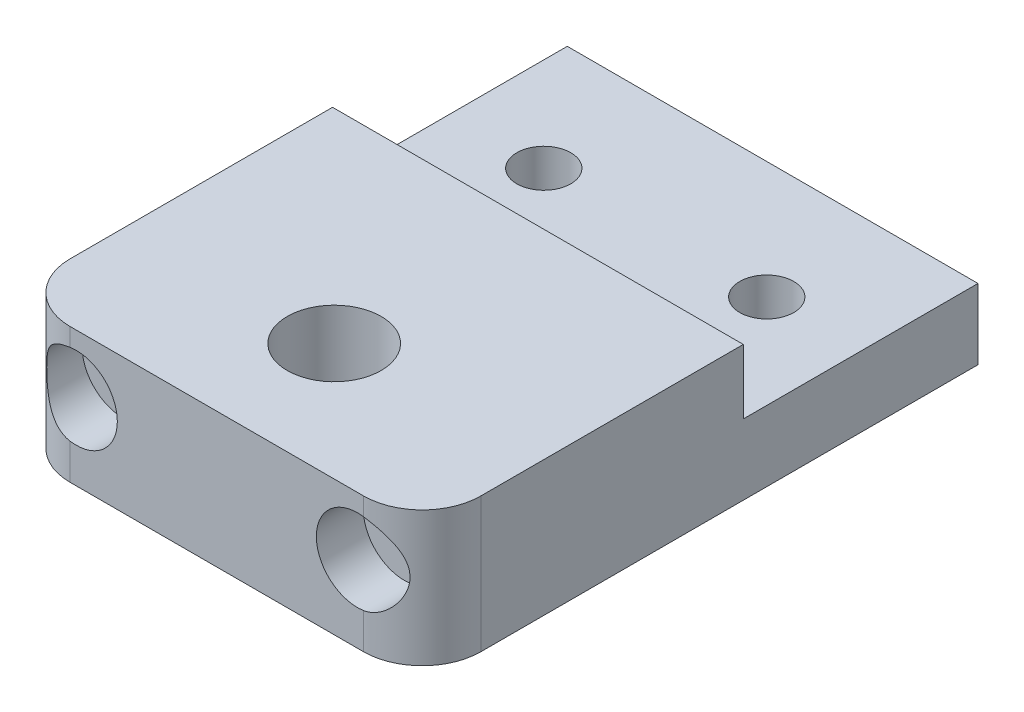
ISO-10303-21;
HEADER;
FILE_DESCRIPTION(('STEP AP214'),'2;1');
FILE_NAME('part.step','',(''),(''),'','','');
FILE_SCHEMA(('AUTOMOTIVE_DESIGN { 1 0 10303 214 1 1 1 1 }'));
ENDSEC;
DATA;
#1=APPLICATION_CONTEXT('core data for automotive mechanical design processes');
#2=APPLICATION_PROTOCOL_DEFINITION('international standard','automotive_design',2000,#1);
#3=PRODUCT_CONTEXT('',#1,'mechanical');
#4=PRODUCT('Part','Part','',(#3));
#5=PRODUCT_RELATED_PRODUCT_CATEGORY('part','',(#4));
#6=PRODUCT_DEFINITION_FORMATION('','',#4);
#7=PRODUCT_DEFINITION_CONTEXT('part definition',#1,'design');
#8=PRODUCT_DEFINITION('design','',#6,#7);
#9=PRODUCT_DEFINITION_SHAPE('','',#8);
#10=(LENGTH_UNIT() NAMED_UNIT(*) SI_UNIT(.MILLI.,.METRE.));
#11=(NAMED_UNIT(*) PLANE_ANGLE_UNIT() SI_UNIT($,.RADIAN.));
#12=(NAMED_UNIT(*) SI_UNIT($,.STERADIAN.) SOLID_ANGLE_UNIT());
#13=UNCERTAINTY_MEASURE_WITH_UNIT(LENGTH_MEASURE(1.E-05),#10,'distance_accuracy_value','');
#14=(GEOMETRIC_REPRESENTATION_CONTEXT(3) GLOBAL_UNCERTAINTY_ASSIGNED_CONTEXT((#13)) GLOBAL_UNIT_ASSIGNED_CONTEXT((#10,
#11,#12)) REPRESENTATION_CONTEXT('',''));
#15=CARTESIAN_POINT('',(0.,0.,0.));
#16=DIRECTION('',(0.,0.,1.));
#17=DIRECTION('',(1.,0.,0.));
#18=AXIS2_PLACEMENT_3D('',#15,#16,#17);
#19=CARTESIAN_POINT('',(0.,5.5,0.));
#20=DIRECTION('',(0.,1.,0.));
#21=DIRECTION('',(0.,0.,1.));
#22=AXIS2_PLACEMENT_3D('',#19,#20,#21);
#23=PLANE('',#22);
#24=DIRECTION('',(1.,0.,0.));
#25=VECTOR('',#24,1.);
#26=CARTESIAN_POINT('',(-17.5,5.5,0.964169605440018));
#27=LINE('',#26,#25);
#28=CARTESIAN_POINT('',(-12.5,5.5,0.964169605440018));
#29=VERTEX_POINT('',#28);
#30=CARTESIAN_POINT('',(12.5,5.5,0.964169605440018));
#31=VERTEX_POINT('',#30);
#32=EDGE_CURVE('E308',#29,#31,#27,.T.);
#33=ORIENTED_EDGE('',*,*,#32,.T.);
#34=CARTESIAN_POINT('',(12.5,5.5,-4.03583039455998));
#35=DIRECTION('',(0.,1.,0.));
#36=DIRECTION('',(0.,0.,1.));
#37=AXIS2_PLACEMENT_3D('',#34,#35,#36);
#38=CIRCLE('',#37,5.);
#39=CARTESIAN_POINT('',(17.5,5.5,-4.03583039455999));
#40=VERTEX_POINT('',#39);
#41=EDGE_CURVE('E189',#31,#40,#38,.T.);
#42=ORIENTED_EDGE('',*,*,#41,.T.);
#43=DIRECTION('',(0.,0.,-1.));
#44=VECTOR('',#43,1.);
#45=CARTESIAN_POINT('',(17.5,5.5,-26.39583039456));
#46=LINE('',#45,#44);
#47=CARTESIAN_POINT('',(17.5,5.5,-26.39583039456));
#48=VERTEX_POINT('',#47);
#49=EDGE_CURVE('E301',#40,#48,#46,.T.);
#50=ORIENTED_EDGE('',*,*,#49,.T.);
#51=DIRECTION('',(-1.,0.,0.));
#52=VECTOR('',#51,1.);
#53=CARTESIAN_POINT('',(-17.5,5.5,-26.39583039456));
#54=LINE('',#53,#52);
#55=CARTESIAN_POINT('',(-17.5,5.5,-26.39583039456));
#56=VERTEX_POINT('',#55);
#57=EDGE_CURVE('E303',#48,#56,#54,.T.);
#58=ORIENTED_EDGE('',*,*,#57,.T.);
#59=DIRECTION('',(0.,0.,1.));
#60=VECTOR('',#59,1.);
#61=CARTESIAN_POINT('',(-17.5,5.5,-26.39583039456));
#62=LINE('',#61,#60);
#63=CARTESIAN_POINT('',(-17.5,5.5,-4.03583039455999));
#64=VERTEX_POINT('',#63);
#65=EDGE_CURVE('E305',#56,#64,#62,.T.);
#66=ORIENTED_EDGE('',*,*,#65,.T.);
#67=CARTESIAN_POINT('',(-12.5,5.5,-4.03583039455998));
#68=DIRECTION('',(0.,1.,0.));
#69=DIRECTION('',(0.,0.,1.));
#70=AXIS2_PLACEMENT_3D('',#67,#68,#69);
#71=CIRCLE('',#70,5.);
#72=EDGE_CURVE('E187',#64,#29,#71,.T.);
#73=ORIENTED_EDGE('',*,*,#72,.T.);
#74=EDGE_LOOP('',(#33,#42,#50,#58,#66,#73));
#75=FACE_BOUND('',#74,.T.);
#76=CARTESIAN_POINT('',(0.,5.5,-9.03583039455998));
#77=DIRECTION('',(0.,1.,0.));
#78=DIRECTION('',(0.,0.,1.));
#79=AXIS2_PLACEMENT_3D('',#76,#77,#78);
#80=CIRCLE('',#79,4.);
#81=CARTESIAN_POINT('',(0.,5.5,-5.03583039455998));
#82=VERTEX_POINT('',#81);
#83=EDGE_CURVE('E295',#82,#82,#80,.T.);
#84=ORIENTED_EDGE('',*,*,#83,.F.);
#85=EDGE_LOOP('',(#84));
#86=FACE_BOUND('',#85,.T.);
#87=ADVANCED_FACE('F82',(#75,#86),#23,.T.);
#88=CARTESIAN_POINT('',(17.5,5.5,-26.39583039456));
#89=DIRECTION('',(-1.,0.,0.));
#90=DIRECTION('',(0.,0.,1.));
#91=AXIS2_PLACEMENT_3D('',#88,#89,#90);
#92=PLANE('',#91);
#93=ORIENTED_EDGE('',*,*,#49,.F.);
#94=DIRECTION('',(0.,-1.,0.));
#95=VECTOR('',#94,1.);
#96=CARTESIAN_POINT('',(17.5,5.5,-4.03583039455998));
#97=LINE('',#96,#95);
#98=CARTESIAN_POINT('',(17.5,-6.,-4.03583039455998));
#99=VERTEX_POINT('',#98);
#100=EDGE_CURVE('E319',#40,#99,#97,.T.);
#101=ORIENTED_EDGE('',*,*,#100,.T.);
#102=DIRECTION('',(0.,0.,-1.));
#103=VECTOR('',#102,1.);
#104=CARTESIAN_POINT('',(17.5,-6.,0.));
#105=LINE('',#104,#103);
#106=CARTESIAN_POINT('',(17.5,-6.,-46.39583039456));
#107=VERTEX_POINT('',#106);
#108=EDGE_CURVE('E271',#99,#107,#105,.T.);
#109=ORIENTED_EDGE('',*,*,#108,.T.);
#110=DIRECTION('',(0.,1.,0.));
#111=VECTOR('',#110,1.);
#112=CARTESIAN_POINT('',(17.5,-6.,-46.39583039456));
#113=LINE('',#112,#111);
#114=CARTESIAN_POINT('',(17.5,0.,-46.39583039456));
#115=VERTEX_POINT('',#114);
#116=EDGE_CURVE('E286',#107,#115,#113,.T.);
#117=ORIENTED_EDGE('',*,*,#116,.T.);
#118=DIRECTION('',(0.,0.,-1.));
#119=VECTOR('',#118,1.);
#120=CARTESIAN_POINT('',(17.5,0.,0.));
#121=LINE('',#120,#119);
#122=CARTESIAN_POINT('',(17.5,0.,-26.39583039456));
#123=VERTEX_POINT('',#122);
#124=EDGE_CURVE('E287',#123,#115,#121,.T.);
#125=ORIENTED_EDGE('',*,*,#124,.F.);
#126=DIRECTION('',(0.,-1.,0.));
#127=VECTOR('',#126,1.);
#128=CARTESIAN_POINT('',(17.5,5.5,-26.39583039456));
#129=LINE('',#128,#127);
#130=EDGE_CURVE('E316',#48,#123,#129,.T.);
#131=ORIENTED_EDGE('',*,*,#130,.F.);
#132=EDGE_LOOP('',(#93,#101,#109,#117,#125,#131));
#133=FACE_BOUND('',#132,.T.);
#134=ADVANCED_FACE('F245',(#133),#92,.F.);
#135=CARTESIAN_POINT('',(-17.5,5.5,-26.39583039456));
#136=DIRECTION('',(0.,0.,1.));
#137=DIRECTION('',(1.,0.,0.));
#138=AXIS2_PLACEMENT_3D('',#135,#136,#137);
#139=PLANE('',#138);
#140=DIRECTION('',(-1.,0.,0.));
#141=VECTOR('',#140,1.);
#142=CARTESIAN_POINT('',(-17.5,0.,-26.39583039456));
#143=LINE('',#142,#141);
#144=CARTESIAN_POINT('',(-17.5,0.,-26.39583039456));
#145=VERTEX_POINT('',#144);
#146=EDGE_CURVE('E300',#123,#145,#143,.T.);
#147=ORIENTED_EDGE('',*,*,#146,.T.);
#148=DIRECTION('',(0.,-1.,0.));
#149=VECTOR('',#148,1.);
#150=CARTESIAN_POINT('',(-17.5,5.5,-26.39583039456));
#151=LINE('',#150,#149);
#152=EDGE_CURVE('E311',#56,#145,#151,.T.);
#153=ORIENTED_EDGE('',*,*,#152,.F.);
#154=ORIENTED_EDGE('',*,*,#57,.F.);
#155=ORIENTED_EDGE('',*,*,#130,.T.);
#156=EDGE_LOOP('',(#147,#153,#154,#155));
#157=FACE_BOUND('',#156,.T.);
#158=ADVANCED_FACE('F252',(#157),#139,.F.);
#159=CARTESIAN_POINT('',(-17.5,5.5,-26.39583039456));
#160=DIRECTION('',(1.,0.,0.));
#161=DIRECTION('',(0.,0.,-1.));
#162=AXIS2_PLACEMENT_3D('',#159,#160,#161);
#163=PLANE('',#162);
#164=DIRECTION('',(0.,0.,-1.));
#165=VECTOR('',#164,1.);
#166=CARTESIAN_POINT('',(-17.5,-6.,0.));
#167=LINE('',#166,#165);
#168=CARTESIAN_POINT('',(-17.5,-6.,-4.03583039455998));
#169=VERTEX_POINT('',#168);
#170=CARTESIAN_POINT('',(-17.5,-6.,-46.39583039456));
#171=VERTEX_POINT('',#170);
#172=EDGE_CURVE('E284',#169,#171,#167,.T.);
#173=ORIENTED_EDGE('',*,*,#172,.F.);
#174=DIRECTION('',(0.,-1.,0.));
#175=VECTOR('',#174,1.);
#176=CARTESIAN_POINT('',(-17.5,5.5,-4.03583039455998));
#177=LINE('',#176,#175);
#178=EDGE_CURVE('E165',#169,#64,#177,.F.);
#179=ORIENTED_EDGE('',*,*,#178,.T.);
#180=ORIENTED_EDGE('',*,*,#65,.F.);
#181=ORIENTED_EDGE('',*,*,#152,.T.);
#182=DIRECTION('',(0.,0.,-1.));
#183=VECTOR('',#182,1.);
#184=CARTESIAN_POINT('',(-17.5,0.,0.));
#185=LINE('',#184,#183);
#186=CARTESIAN_POINT('',(-17.5,0.,-46.39583039456));
#187=VERTEX_POINT('',#186);
#188=EDGE_CURVE('E272',#145,#187,#185,.T.);
#189=ORIENTED_EDGE('',*,*,#188,.T.);
#190=DIRECTION('',(0.,1.,0.));
#191=VECTOR('',#190,1.);
#192=CARTESIAN_POINT('',(-17.5,-6.,-46.39583039456));
#193=LINE('',#192,#191);
#194=EDGE_CURVE('E292',#171,#187,#193,.T.);
#195=ORIENTED_EDGE('',*,*,#194,.F.);
#196=EDGE_LOOP('',(#173,#179,#180,#181,#189,#195));
#197=FACE_BOUND('',#196,.T.);
#198=ADVANCED_FACE('F249',(#197),#163,.F.);
#199=CARTESIAN_POINT('',(-17.5,5.5,0.964169605440018));
#200=DIRECTION('',(0.,0.,-1.));
#201=DIRECTION('',(-1.,0.,0.));
#202=AXIS2_PLACEMENT_3D('',#199,#200,#201);
#203=PLANE('',#202);
#204=DIRECTION('',(0.,-1.,0.));
#205=VECTOR('',#204,1.);
#206=CARTESIAN_POINT('',(12.5,5.5,0.964169605440018));
#207=LINE('',#206,#205);
#208=CARTESIAN_POINT('',(12.5,-6.,0.964169605440018));
#209=VERTEX_POINT('',#208);
#210=CARTESIAN_POINT('',(12.5,-2.96118097196543,0.964169605440018));
#211=VERTEX_POINT('',#210);
#212=EDGE_CURVE('E185',#209,#211,#207,.F.);
#213=ORIENTED_EDGE('',*,*,#212,.T.);
#214=CARTESIAN_POINT('',(11.9801670659679,0.5,0.964169605440018));
#215=DIRECTION('',(0.,0.,-1.));
#216=DIRECTION('',(-1.,0.,0.));
#217=AXIS2_PLACEMENT_3D('',#214,#215,#216);
#218=CIRCLE('',#217,3.5);
#219=CARTESIAN_POINT('',(12.5,3.96118097196543,0.964169605440018));
#220=VERTEX_POINT('',#219);
#221=EDGE_CURVE('E100',#211,#220,#218,.T.);
#222=ORIENTED_EDGE('',*,*,#221,.T.);
#223=EDGE_CURVE('E181',#220,#31,#207,.F.);
#224=ORIENTED_EDGE('',*,*,#223,.T.);
#225=ORIENTED_EDGE('',*,*,#32,.F.);
#226=DIRECTION('',(0.,-1.,0.));
#227=VECTOR('',#226,1.);
#228=CARTESIAN_POINT('',(-12.5,5.5,0.964169605440018));
#229=LINE('',#228,#227);
#230=CARTESIAN_POINT('',(-12.5,3.96118097196543,0.964169605440018));
#231=VERTEX_POINT('',#230);
#232=EDGE_CURVE('E173',#29,#231,#229,.T.);
#233=ORIENTED_EDGE('',*,*,#232,.T.);
#234=CARTESIAN_POINT('',(-11.9801670659679,0.500000000000003,0.964169605440018));
#235=DIRECTION('',(0.,0.,-1.));
#236=DIRECTION('',(-1.,0.,0.));
#237=AXIS2_PLACEMENT_3D('',#234,#235,#236);
#238=CIRCLE('',#237,3.5);
#239=CARTESIAN_POINT('',(-12.5,-2.96118097196542,0.964169605440019));
#240=VERTEX_POINT('',#239);
#241=EDGE_CURVE('E107',#231,#240,#238,.T.);
#242=ORIENTED_EDGE('',*,*,#241,.T.);
#243=CARTESIAN_POINT('',(-12.5,-6.,0.964169605440018));
#244=VERTEX_POINT('',#243);
#245=EDGE_CURVE('E170',#240,#244,#229,.T.);
#246=ORIENTED_EDGE('',*,*,#245,.T.);
#247=DIRECTION('',(1.,0.,0.));
#248=VECTOR('',#247,1.);
#249=CARTESIAN_POINT('',(0.,-6.,0.964169605440018));
#250=LINE('',#249,#248);
#251=EDGE_CURVE('E269',#244,#209,#250,.T.);
#252=ORIENTED_EDGE('',*,*,#251,.T.);
#253=EDGE_LOOP('',(#213,#222,#224,#225,#233,#242,#246,#252));
#254=FACE_BOUND('',#253,.T.);
#255=ADVANCED_FACE('F168',(#254),#203,.F.);
#256=CARTESIAN_POINT('',(0.,5.5,-9.03583039455998));
#257=DIRECTION('',(0.,-1.,0.));
#258=DIRECTION('',(0.,0.,-1.));
#259=AXIS2_PLACEMENT_3D('',#256,#257,#258);
#260=CYLINDRICAL_SURFACE('',#259,4.);
#261=ORIENTED_EDGE('',*,*,#83,.T.);
#262=EDGE_LOOP('',(#261));
#263=FACE_BOUND('',#262,.T.);
#264=CARTESIAN_POINT('',(0.,-6.,-9.03583039455998));
#265=DIRECTION('',(0.,1.,0.));
#266=DIRECTION('',(0.,0.,1.));
#267=AXIS2_PLACEMENT_3D('',#264,#265,#266);
#268=CIRCLE('',#267,4.);
#269=CARTESIAN_POINT('',(0.,-6.,-5.03583039455998));
#270=VERTEX_POINT('',#269);
#271=EDGE_CURVE('E341',#270,#270,#268,.T.);
#272=ORIENTED_EDGE('',*,*,#271,.F.);
#273=EDGE_LOOP('',(#272));
#274=FACE_BOUND('',#273,.T.);
#275=ADVANCED_FACE('F235',(#263,#274),#260,.F.);
#276=CARTESIAN_POINT('',(0.,0.,0.));
#277=DIRECTION('',(0.,1.,0.));
#278=DIRECTION('',(0.,0.,1.));
#279=AXIS2_PLACEMENT_3D('',#276,#277,#278);
#280=PLANE('',#279);
#281=CARTESIAN_POINT('',(-9.5,0.,-36.39583039456));
#282=DIRECTION('',(0.,1.,0.));
#283=DIRECTION('',(0.,0.,1.));
#284=AXIS2_PLACEMENT_3D('',#281,#282,#283);
#285=CIRCLE('',#284,2.3);
#286=CARTESIAN_POINT('',(-9.5,0.,-34.09583039456));
#287=VERTEX_POINT('',#286);
#288=EDGE_CURVE('E279',#287,#287,#285,.T.);
#289=ORIENTED_EDGE('',*,*,#288,.F.);
#290=EDGE_LOOP('',(#289));
#291=FACE_BOUND('',#290,.T.);
#292=CARTESIAN_POINT('',(9.50000000000001,0.,-36.39583039456));
#293=DIRECTION('',(0.,1.,0.));
#294=DIRECTION('',(0.,0.,1.));
#295=AXIS2_PLACEMENT_3D('',#292,#293,#294);
#296=CIRCLE('',#295,2.3);
#297=CARTESIAN_POINT('',(9.50000000000001,0.,-34.09583039456));
#298=VERTEX_POINT('',#297);
#299=EDGE_CURVE('E342',#298,#298,#296,.T.);
#300=ORIENTED_EDGE('',*,*,#299,.F.);
#301=EDGE_LOOP('',(#300));
#302=FACE_BOUND('',#301,.T.);
#303=ORIENTED_EDGE('',*,*,#146,.F.);
#304=ORIENTED_EDGE('',*,*,#124,.T.);
#305=DIRECTION('',(1.,0.,0.));
#306=VECTOR('',#305,1.);
#307=CARTESIAN_POINT('',(0.,0.,-46.39583039456));
#308=LINE('',#307,#306);
#309=EDGE_CURVE('E276',#187,#115,#308,.T.);
#310=ORIENTED_EDGE('',*,*,#309,.F.);
#311=ORIENTED_EDGE('',*,*,#188,.F.);
#312=EDGE_LOOP('',(#303,#304,#310,#311));
#313=FACE_BOUND('',#312,.T.);
#314=ADVANCED_FACE('F232',(#291,#302,#313),#280,.T.);
#315=CARTESIAN_POINT('',(0.,-6.,-46.39583039456));
#316=DIRECTION('',(0.,0.,1.));
#317=DIRECTION('',(1.,0.,0.));
#318=AXIS2_PLACEMENT_3D('',#315,#316,#317);
#319=PLANE('',#318);
#320=ORIENTED_EDGE('',*,*,#309,.T.);
#321=ORIENTED_EDGE('',*,*,#116,.F.);
#322=DIRECTION('',(1.,0.,0.));
#323=VECTOR('',#322,1.);
#324=CARTESIAN_POINT('',(0.,-6.,-46.39583039456));
#325=LINE('',#324,#323);
#326=EDGE_CURVE('E274',#171,#107,#325,.T.);
#327=ORIENTED_EDGE('',*,*,#326,.F.);
#328=ORIENTED_EDGE('',*,*,#194,.T.);
#329=EDGE_LOOP('',(#320,#321,#327,#328));
#330=FACE_BOUND('',#329,.T.);
#331=ADVANCED_FACE('F230',(#330),#319,.F.);
#332=CARTESIAN_POINT('',(0.,-6.,0.));
#333=DIRECTION('',(0.,1.,0.));
#334=DIRECTION('',(0.,0.,1.));
#335=AXIS2_PLACEMENT_3D('',#332,#333,#334);
#336=PLANE('',#335);
#337=ORIENTED_EDGE('',*,*,#271,.T.);
#338=EDGE_LOOP('',(#337));
#339=FACE_BOUND('',#338,.T.);
#340=CARTESIAN_POINT('',(9.50000000000001,-6.,-36.39583039456));
#341=DIRECTION('',(0.,1.,0.));
#342=DIRECTION('',(0.,0.,1.));
#343=AXIS2_PLACEMENT_3D('',#340,#341,#342);
#344=CIRCLE('',#343,2.3);
#345=CARTESIAN_POINT('',(9.50000000000001,-6.,-34.09583039456));
#346=VERTEX_POINT('',#345);
#347=EDGE_CURVE('E346',#346,#346,#344,.T.);
#348=ORIENTED_EDGE('',*,*,#347,.T.);
#349=EDGE_LOOP('',(#348));
#350=FACE_BOUND('',#349,.T.);
#351=CARTESIAN_POINT('',(-9.5,-6.,-36.39583039456));
#352=DIRECTION('',(0.,1.,0.));
#353=DIRECTION('',(0.,0.,1.));
#354=AXIS2_PLACEMENT_3D('',#351,#352,#353);
#355=CIRCLE('',#354,2.3);
#356=CARTESIAN_POINT('',(-9.5,-6.,-34.09583039456));
#357=VERTEX_POINT('',#356);
#358=EDGE_CURVE('E289',#357,#357,#355,.T.);
#359=ORIENTED_EDGE('',*,*,#358,.T.);
#360=EDGE_LOOP('',(#359));
#361=FACE_BOUND('',#360,.T.);
#362=ORIENTED_EDGE('',*,*,#108,.F.);
#363=CARTESIAN_POINT('',(12.5,-6.,-4.03583039455998));
#364=DIRECTION('',(0.,1.,0.));
#365=DIRECTION('',(0.,0.,1.));
#366=AXIS2_PLACEMENT_3D('',#363,#364,#365);
#367=CIRCLE('',#366,5.);
#368=EDGE_CURVE('E179',#99,#209,#367,.F.);
#369=ORIENTED_EDGE('',*,*,#368,.T.);
#370=ORIENTED_EDGE('',*,*,#251,.F.);
#371=CARTESIAN_POINT('',(-12.5,-6.,-4.03583039455998));
#372=DIRECTION('',(0.,1.,0.));
#373=DIRECTION('',(0.,0.,1.));
#374=AXIS2_PLACEMENT_3D('',#371,#372,#373);
#375=CIRCLE('',#374,5.);
#376=EDGE_CURVE('E177',#244,#169,#375,.F.);
#377=ORIENTED_EDGE('',*,*,#376,.T.);
#378=ORIENTED_EDGE('',*,*,#172,.T.);
#379=ORIENTED_EDGE('',*,*,#326,.T.);
#380=EDGE_LOOP('',(#362,#369,#370,#377,#378,#379));
#381=FACE_BOUND('',#380,.T.);
#382=ADVANCED_FACE('F226',(#339,#350,#361,#381),#336,.F.);
#383=CARTESIAN_POINT('',(-9.5,-6.,-36.39583039456));
#384=DIRECTION('',(0.,1.,0.));
#385=DIRECTION('',(0.,0.,1.));
#386=AXIS2_PLACEMENT_3D('',#383,#384,#385);
#387=CYLINDRICAL_SURFACE('',#386,2.3);
#388=ORIENTED_EDGE('',*,*,#358,.F.);
#389=EDGE_LOOP('',(#388));
#390=FACE_BOUND('',#389,.T.);
#391=ORIENTED_EDGE('',*,*,#288,.T.);
#392=EDGE_LOOP('',(#391));
#393=FACE_BOUND('',#392,.T.);
#394=ADVANCED_FACE('F222',(#390,#393),#387,.F.);
#395=CARTESIAN_POINT('',(9.50000000000001,-6.,-36.39583039456));
#396=DIRECTION('',(0.,1.,0.));
#397=DIRECTION('',(0.,0.,1.));
#398=AXIS2_PLACEMENT_3D('',#395,#396,#397);
#399=CYLINDRICAL_SURFACE('',#398,2.3);
#400=ORIENTED_EDGE('',*,*,#347,.F.);
#401=EDGE_LOOP('',(#400));
#402=FACE_BOUND('',#401,.T.);
#403=ORIENTED_EDGE('',*,*,#299,.T.);
#404=EDGE_LOOP('',(#403));
#405=FACE_BOUND('',#404,.T.);
#406=ADVANCED_FACE('F218',(#402,#405),#399,.F.);
#407=CARTESIAN_POINT('',(12.5,5.5,-4.03583039455998));
#408=DIRECTION('',(0.,-1.,0.));
#409=DIRECTION('',(0.,0.,-1.));
#410=AXIS2_PLACEMENT_3D('',#407,#408,#409);
#411=CYLINDRICAL_SURFACE('',#410,5.);
#412=CARTESIAN_POINT('',(8.48016706596786,0.5,-1.06245803602994));
#413=CARTESIAN_POINT('',(8.48016757046418,0.435221314937918,-1.06245685749619));
#414=CARTESIAN_POINT('',(8.48197104663153,0.370427311382531,-1.06001370696156));
#415=CARTESIAN_POINT('',(8.48913526232089,0.241378857321301,-1.05036650650256));
#416=CARTESIAN_POINT('',(8.49449805704631,0.177124740273242,-1.04315970598577));
#417=CARTESIAN_POINT('',(8.51578715256638,-0.0143318382392824,-1.01479760228593));
#418=CARTESIAN_POINT('',(8.53691356359985,-0.140008866487379,-0.986902230574073));
#419=CARTESIAN_POINT('',(8.60060315969884,-0.425553831645496,-0.905637698316023));
#420=CARTESIAN_POINT('',(8.64798337769382,-0.582725892478312,-0.846859211572309));
#421=CARTESIAN_POINT('',(8.76129566342238,-0.883785344756231,-0.714735886931128));
#422=CARTESIAN_POINT('',(8.82727687592112,-1.02763618495956,-0.64135261555058));
#423=CARTESIAN_POINT('',(8.9542939780479,-1.26249142132317,-0.509672268605949));
#424=CARTESIAN_POINT('',(9.01125348142523,-1.35675864803289,-0.453140018994493));
#425=CARTESIAN_POINT('',(9.13321912962496,-1.53884846471764,-0.338291088157737));
#426=CARTESIAN_POINT('',(9.19822827006064,-1.6266686359854,-0.279973748738746));
#427=CARTESIAN_POINT('',(9.33612009017699,-1.79585082785268,-0.163099432725834));
#428=CARTESIAN_POINT('',(9.4090085911466,-1.87720799551817,-0.104542310135169));
#429=CARTESIAN_POINT('',(9.56250891345694,-2.033159471427,0.0114402131703911));
#430=CARTESIAN_POINT('',(9.64312006301611,-2.10775436681353,0.068865711800533));
#431=CARTESIAN_POINT('',(9.81265574932272,-2.2503194556848,0.181827662232779));
#432=CARTESIAN_POINT('',(9.90164187243647,-2.31823161193997,0.237345231025964));
#433=CARTESIAN_POINT('',(10.0872220742961,-2.44609181479295,0.344809060882316));
#434=CARTESIAN_POINT('',(10.1838172435927,-2.50603871646708,0.396754808016087));
#435=CARTESIAN_POINT('',(10.3840352584428,-2.6169563457595,0.495739058833714));
#436=CARTESIAN_POINT('',(10.4876386374188,-2.66795062854526,0.5427903031733));
#437=CARTESIAN_POINT('',(10.7014592597192,-2.76013226803274,0.630927491182313));
#438=CARTESIAN_POINT('',(10.8116727844869,-2.80132507498125,0.672016745115799));
#439=CARTESIAN_POINT('',(11.0789479391315,-2.88583440751177,0.760720433778938));
#440=CARTESIAN_POINT('',(11.2385359428297,-2.92453021360702,0.805319663624063));
#441=CARTESIAN_POINT('',(11.5649924399743,-2.97922242498746,0.878813336977374));
#442=CARTESIAN_POINT('',(11.7318554584142,-2.99523560680107,0.907719377716564));
#443=CARTESIAN_POINT('',(12.0687819652286,-3.00294251964184,0.948435782995452));
#444=CARTESIAN_POINT('',(12.2388536281577,-2.99456231438088,0.960194010572554));
#445=CARTESIAN_POINT('',(12.576274257648,-2.95305077506331,0.966436169867468));
#446=CARTESIAN_POINT('',(12.7436228268737,-2.91991586147553,0.960917602992318));
#447=CARTESIAN_POINT('',(13.0632992019379,-2.83213313366048,0.934814689879344));
#448=CARTESIAN_POINT('',(13.2159639117625,-2.77849422151301,0.914902766524642));
#449=CARTESIAN_POINT('',(13.5107432970118,-2.65168307064466,0.863232494325847));
#450=CARTESIAN_POINT('',(13.6528560247826,-2.57850723725488,0.831471964986129));
#451=CARTESIAN_POINT('',(13.9361765183133,-2.40753870974391,0.75590784847357));
#452=CARTESIAN_POINT('',(14.0761930269371,-2.30814140358816,0.711287674263619));
#453=CARTESIAN_POINT('',(14.3390886139768,-2.09125141150568,0.615766947893456));
#454=CARTESIAN_POINT('',(14.4619514579848,-1.97374180220068,0.564860531068476));
#455=CARTESIAN_POINT('',(14.706547999599,-1.70340384744202,0.453251625697894));
#456=CARTESIAN_POINT('',(14.8252214958106,-1.54792271496974,0.392243703080038));
#457=CARTESIAN_POINT('',(15.0357582950589,-1.21802747340068,0.275138674242662));
#458=CARTESIAN_POINT('',(15.1276279956506,-1.04361789582034,0.219040398425438));
#459=CARTESIAN_POINT('',(15.2697541768191,-0.706902640980855,0.127639307384327));
#460=CARTESIAN_POINT('',(15.3242530194631,-0.54690939660922,0.0904610910555425));
#461=CARTESIAN_POINT('',(15.4098640343199,-0.218271940862865,0.0305517663442561));
#462=CARTESIAN_POINT('',(15.4410111235891,-0.0496410500681198,0.00779909584453646));
#463=CARTESIAN_POINT('',(15.478291095584,0.292829567027382,-0.0195677179194723));
#464=CARTESIAN_POINT('',(15.4842894247072,0.466692311938021,-0.0240842876922081));
#465=CARTESIAN_POINT('',(15.4704610967125,0.812841908862518,-0.0138385036772626));
#466=CARTESIAN_POINT('',(15.4506255283223,0.985128196437716,0.000930502576980757));
#467=CARTESIAN_POINT('',(15.3889703836663,1.30944732939623,0.0452372253414388));
#468=CARTESIAN_POINT('',(15.3489816223873,1.4620129672466,0.0735362710585018));
#469=CARTESIAN_POINT('',(15.2498759677853,1.75834878602797,0.140501082506342));
#470=CARTESIAN_POINT('',(15.1907514788733,1.90211544737066,0.179170963710742));
#471=CARTESIAN_POINT('',(15.0453148394605,2.19879884102295,0.268776929333198));
#472=CARTESIAN_POINT('',(14.9563328557411,2.35011178766449,0.320675243954244));
#473=CARTESIAN_POINT('',(14.7572977203947,2.63731596649557,0.427056622941793));
#474=CARTESIAN_POINT('',(14.6472222291712,2.77319060314104,0.481542381170234));
#475=CARTESIAN_POINT('',(14.3877895341564,3.04847519265643,0.596613011647848));
#476=CARTESIAN_POINT('',(14.2349523554153,3.18483117758731,0.6567386316439));
#477=CARTESIAN_POINT('',(13.9052350004377,3.430222455243,0.765768451653768));
#478=CARTESIAN_POINT('',(13.7283820713019,3.53928831703511,0.814685202075135));
#479=CARTESIAN_POINT('',(13.3923471465858,3.70680246656276,0.886266824556207));
#480=CARTESIAN_POINT('',(13.236741248515,3.77101633792305,0.912229925265135));
#481=CARTESIAN_POINT('',(12.9163249676578,3.87668447514748,0.949408758312803));
#482=CARTESIAN_POINT('',(12.7515222068419,3.91815728805617,0.960636518876477));
#483=CARTESIAN_POINT('',(12.4168202427305,3.97682031289671,0.966285640823637));
#484=CARTESIAN_POINT('',(12.2469073441303,3.99393796472964,0.960656936608228));
#485=CARTESIAN_POINT('',(11.9078743991712,4.00336080911279,0.931898555483439));
#486=CARTESIAN_POINT('',(11.7387544447311,3.99566319295297,0.908766897733318));
#487=CARTESIAN_POINT('',(11.4139820956894,3.95759788526251,0.847475025301954));
#488=CARTESIAN_POINT('',(11.258066229811,3.92826727341396,0.810038917718885));
#489=CARTESIAN_POINT('',(10.9550903703431,3.85018171476956,0.722127857170598));
#490=CARTESIAN_POINT('',(10.8080325980222,3.80142191903345,0.67164965039598));
#491=CARTESIAN_POINT('',(10.511662764702,3.68141993802501,0.554838102138271));
#492=CARTESIAN_POINT('',(10.363456572942,3.60848568207737,0.487455843922317));
#493=CARTESIAN_POINT('',(10.0820006272715,3.4450785735759,0.343475120761538));
#494=CARTESIAN_POINT('',(9.94875949273617,3.35459569457263,0.266871396645411));
#495=CARTESIAN_POINT('',(9.67312771695305,3.13893502316548,0.0921709807157085));
#496=CARTESIAN_POINT('',(9.53413672989469,3.01043461444753,-0.00718064184305202));
#497=CARTESIAN_POINT('',(9.27901507108374,2.73366848061154,-0.208087251915729));
#498=CARTESIAN_POINT('',(9.1629103235372,2.58538065656173,-0.309644595073893));
#499=CARTESIAN_POINT('',(8.96588877989476,2.28677834147149,-0.496560680955552));
#500=CARTESIAN_POINT('',(8.88251943089301,2.13843448329437,-0.582480548222396));
#501=CARTESIAN_POINT('',(8.73643513069762,1.82583701357411,-0.742316639616072));
#502=CARTESIAN_POINT('',(8.67368142151889,1.66161401673137,-0.816255254610625));
#503=CARTESIAN_POINT('',(8.58767926390995,1.36982440800867,-0.921842936105399));
#504=CARTESIAN_POINT('',(8.5582203294789,1.24630688084539,-0.959514244032822));
#505=CARTESIAN_POINT('',(8.51273319978202,0.993223629453309,-1.01868925722068));
#506=CARTESIAN_POINT('',(8.49665621663357,0.863681709894679,-1.04025166254029));
#507=CARTESIAN_POINT('',(8.48534543652218,0.69426988363934,-1.05546869680429));
#508=CARTESIAN_POINT('',(8.48340650587787,0.655497632200019,-1.0580830991893));
#509=CARTESIAN_POINT('',(8.48081703161292,0.577818780909897,-1.06157830773648));
#510=CARTESIAN_POINT('',(8.48016676292005,0.538912154164166,-1.06245874396785));
#511=CARTESIAN_POINT('',(8.48016706596786,0.5,-1.06245803602994));
#512=B_SPLINE_CURVE_WITH_KNOTS('',3,(#412,#413,#414,#415,#416,#417,#418,#419,#420,#421,#422,
#423,#424,#425,#426,#427,#428,#429,#430,#431,#432,#433,#434,#435,#436,#437,#438,#439,#440,#441,
#442,#443,#444,#445,#446,#447,#448,#449,#450,#451,#452,#453,#454,#455,#456,#457,#458,#459,#460,
#461,#462,#463,#464,#465,#466,#467,#468,#469,#470,#471,#472,#473,#474,#475,#476,#477,#478,#479,
#480,#481,#482,#483,#484,#485,#486,#487,#488,#489,#490,#491,#492,#493,#494,#495,#496,#497,#498,
#499,#500,#501,#502,#503,#504,#505,#506,#507,#508,#509,#510,#511),.UNSPECIFIED.,.T.,.F.,(4,2,2,
2,2,2,2,2,2,2,2,2,2,2,2,2,2,2,2,2,2,2,2,2,2,2,2,2,2,2,2,2,2,2,2,2,2,2,2,2,2,2,2,2,2,2,2,2,2,4),
(0.,0.194288905072421,0.38869009315812,0.77814169199561,1.29841483280971,1.82007565559363,
2.19105875989935,2.56218034012441,2.93357800429411,3.30494339042512,3.67929230875781,
4.05369497783277,4.42709729374194,4.80029148631226,5.30846653506694,5.81626553065747,
6.32560526473897,6.83501866361195,7.3220557195579,7.80918244904556,8.33938446721796,
8.87008492113996,9.48213788456297,10.0940446428783,10.6111299567991,11.1274405406633,
11.6465100473912,12.1657586519522,12.6446014791635,13.1236346081552,13.6707536823821,
14.218455431308,14.8557031668782,15.4922338604131,16.0010256040213,16.50940177013,
17.0192893667514,17.5292346769017,18.016203230401,18.5032933928086,19.0365209448888,
19.570054060185,20.2090757812363,20.8488172411571,21.41905221007,21.988208902851,
22.3841998049293,22.7787406012906,22.8954238500585,23.0121319897702),.UNSPECIFIED.);
#513=EDGE_CURVE('E12',#211,#220,#512,.T.);
#514=ORIENTED_EDGE('',*,*,#513,.F.);
#515=ORIENTED_EDGE('',*,*,#212,.F.);
#516=ORIENTED_EDGE('',*,*,#368,.F.);
#517=ORIENTED_EDGE('',*,*,#100,.F.);
#518=ORIENTED_EDGE('',*,*,#41,.F.);
#519=ORIENTED_EDGE('',*,*,#223,.F.);
#520=EDGE_LOOP('',(#514,#515,#516,#517,#518,#519));
#521=FACE_BOUND('',#520,.T.);
#522=ADVANCED_FACE('F221',(#521),#411,.T.);
#523=CARTESIAN_POINT('',(-12.5,5.5,-4.03583039455998));
#524=DIRECTION('',(0.,-1.,0.));
#525=DIRECTION('',(0.,0.,-1.));
#526=AXIS2_PLACEMENT_3D('',#523,#524,#525);
#527=CYLINDRICAL_SURFACE('',#526,5.);
#528=CARTESIAN_POINT('',(-15.4801670659679,0.500000000000003,-0.0210322353842909));
#529=CARTESIAN_POINT('',(-15.4801711076804,0.411254496325717,-0.0210388233435699));
#530=CARTESIAN_POINT('',(-15.4767887634102,0.322540144363776,-0.0185188602817761));
#531=CARTESIAN_POINT('',(-15.4633314014558,0.145870792806854,-0.00858026037314503));
#532=CARTESIAN_POINT('',(-15.4532551636124,0.0579159346134176,-0.00116073043744511));
#533=CARTESIAN_POINT('',(-15.4265618302046,-0.116574018162006,0.0182422485122274));
#534=CARTESIAN_POINT('',(-15.409937692731,-0.203107479392395,0.0302306106046206));
#535=CARTESIAN_POINT('',(-15.3704031775053,-0.374076117696797,0.0582347896021835));
#536=CARTESIAN_POINT('',(-15.3474898252338,-0.458510281237047,0.0742525119158011));
#537=CARTESIAN_POINT('',(-15.2701623624683,-0.706531861094195,0.127112071897909));
#538=CARTESIAN_POINT('',(-15.2069165627305,-0.866386348968041,0.168952065173419));
#539=CARTESIAN_POINT('',(-15.0590325109343,-1.17322222025264,0.260550615224694));
#540=CARTESIAN_POINT('',(-14.9743875879401,-1.32019957008559,0.310311639497876));
#541=CARTESIAN_POINT('',(-14.7734985515109,-1.61740004054676,0.419036624499071));
#542=CARTESIAN_POINT('',(-14.654620481489,-1.76571089776037,0.47837134750261));
#543=CARTESIAN_POINT('',(-14.3935527376992,-2.04198016658208,0.593943669342706));
#544=CARTESIAN_POINT('',(-14.25134747263,-2.16992485249226,0.650179162918205));
#545=CARTESIAN_POINT('',(-14.0165594300635,-2.34846690063646,0.729417855352455));
#546=CARTESIAN_POINT('',(-13.9313990847293,-2.40749211942849,0.75577235393289));
#547=CARTESIAN_POINT('',(-13.7554336018889,-2.51814780667616,0.804852677521751));
#548=CARTESIAN_POINT('',(-13.6646312594872,-2.56978189554238,0.827580279730212));
#549=CARTESIAN_POINT('',(-13.4780346413022,-2.6650207898759,0.868511122939799));
#550=CARTESIAN_POINT('',(-13.3822448867636,-2.708632710516,0.886718378274593));
#551=CARTESIAN_POINT('',(-13.1863766524443,-2.78727652564637,0.917825896838964));
#552=CARTESIAN_POINT('',(-13.0862991262285,-2.82231031632321,0.930727333343485));
#553=CARTESIAN_POINT('',(-12.8962701231724,-2.87923881092254,0.949231771122233));
#554=CARTESIAN_POINT('',(-12.8067259324029,-2.9022574870078,0.955573412724079));
#555=CARTESIAN_POINT('',(-12.6258977670591,-2.94116003860892,0.963403252069986));
#556=CARTESIAN_POINT('',(-12.5346140527813,-2.95704497298982,0.964892170311749));
#557=CARTESIAN_POINT('',(-12.3511775364223,-2.98150880305792,0.962794842491171));
#558=CARTESIAN_POINT('',(-12.2590252717384,-2.99009195047079,0.959211553145276));
#559=CARTESIAN_POINT('',(-12.0747022031638,-2.99994219890128,0.946907015870054));
#560=CARTESIAN_POINT('',(-11.982531401034,-3.00120981468488,0.938186129501374));
#561=CARTESIAN_POINT('',(-11.7289268230302,-2.99471036079259,0.907034828126921));
#562=CARTESIAN_POINT('',(-11.5682635148105,-2.97931814298262,0.879221305313474));
#563=CARTESIAN_POINT('',(-11.2537826202156,-2.9275118439713,0.809062423811394));
#564=CARTESIAN_POINT('',(-11.0999665007098,-2.89109328143049,0.766713968076713));
#565=CARTESIAN_POINT('',(-10.7955727989555,-2.79745440300391,0.667537704656756));
#566=CARTESIAN_POINT('',(-10.6454433106518,-2.73938116553076,0.610149815841387));
#567=CARTESIAN_POINT('',(-10.3581452030758,-2.60551090324061,0.484906105159711));
#568=CARTESIAN_POINT('',(-10.2209782580129,-2.52971159334984,0.417048934078885));
#569=CARTESIAN_POINT('',(-9.93808217633596,-2.34830178142389,0.261488241796816));
#570=CARTESIAN_POINT('',(-9.7949870718773,-2.23980162298858,0.172383138774573));
#571=CARTESIAN_POINT('',(-9.52848153681869,-2.00419289040146,-0.0113656629365256));
#572=CARTESIAN_POINT('',(-9.40511711973608,-1.87704210706624,-0.106021624439441));
#573=CARTESIAN_POINT('',(-9.22374209510574,-1.65950837142631,-0.257724678193334));
#574=CARTESIAN_POINT('',(-9.15919903694703,-1.574508871076,-0.314818838267972));
#575=CARTESIAN_POINT('',(-9.03770365205718,-1.39825565879933,-0.427594583274695));
#576=CARTESIAN_POINT('',(-8.98075476701723,-1.30699913935876,-0.483275518537908));
#577=CARTESIAN_POINT('',(-8.87492962202799,-1.11838428095188,-0.591331998895364));
#578=CARTESIAN_POINT('',(-8.82603523081997,-1.02104034664014,-0.643714799308971));
#579=CARTESIAN_POINT('',(-8.73675104576853,-0.819977332729484,-0.743048679126245));
#580=CARTESIAN_POINT('',(-8.69635293843807,-0.716264614518307,-0.790005047747187));
#581=CARTESIAN_POINT('',(-8.62139585190061,-0.491942119304161,-0.87985554690671));
#582=CARTESIAN_POINT('',(-8.58778026898503,-0.370668433664092,-0.921916817836076));
#583=CARTESIAN_POINT('',(-8.53341632028971,-0.121376453621865,-0.991460388671123));
#584=CARTESIAN_POINT('',(-8.51263720442043,0.00662491920040435,-1.01897750643517));
#585=CARTESIAN_POINT('',(-8.48535779129395,0.268230750206179,-1.0553574682186));
#586=CARTESIAN_POINT('',(-8.47900157250246,0.401878275615429,-1.06403204717096));
#587=CARTESIAN_POINT('',(-8.48168890469031,0.668752585394495,-1.06040229677438));
#588=CARTESIAN_POINT('',(-8.49073806459891,0.801979198820349,-1.04809032645118));
#589=CARTESIAN_POINT('',(-8.52482317414976,1.07568300580458,-1.00287810648571));
#590=CARTESIAN_POINT('',(-8.55128239635679,1.21566397451305,-0.96815074248621));
#591=CARTESIAN_POINT('',(-8.61926066642724,1.4869040190657,-0.882609483061799));
#592=CARTESIAN_POINT('',(-8.66082128174513,1.61813782633336,-0.831751236046617));
#593=CARTESIAN_POINT('',(-8.74513540415275,1.83975737744628,-0.73369517755192));
#594=CARTESIAN_POINT('',(-8.78507108910655,1.93223980346782,-0.688683807273631));
#595=CARTESIAN_POINT('',(-8.87184357996373,2.11191904246838,-0.594818334078261));
#596=CARTESIAN_POINT('',(-8.91868387353183,2.19911315260469,-0.545962294985104));
#597=CARTESIAN_POINT('',(-9.01894915805897,2.36838898065771,-0.445940530740193));
#598=CARTESIAN_POINT('',(-9.07238231355489,2.45046416619511,-0.394771992500528));
#599=CARTESIAN_POINT('',(-9.18556642138994,2.60943740711419,-0.291447392043273));
#600=CARTESIAN_POINT('',(-9.24531633858908,2.68633630737379,-0.239291492772882));
#601=CARTESIAN_POINT('',(-9.37368929235331,2.83806712561131,-0.132828896065105));
#602=CARTESIAN_POINT('',(-9.44258050373035,2.91267457218113,-0.0785243952482312));
#603=CARTESIAN_POINT('',(-9.58702493331962,3.05601887208036,0.0289823274246798));
#604=CARTESIAN_POINT('',(-9.66258068605756,3.1247534722324,0.08218412033913));
#605=CARTESIAN_POINT('',(-9.89888467806394,3.32138089669706,0.238479785751776));
#606=CARTESIAN_POINT('',(-10.0696106193389,3.44010298031145,0.3385565657893));
#607=CARTESIAN_POINT('',(-10.4019115612997,3.62864912539737,0.505742730712288));
#608=CARTESIAN_POINT('',(-10.5592943427024,3.70345984596241,0.575522742162228));
#609=CARTESIAN_POINT('',(-10.8060768719161,3.79837820594126,0.6693156458294));
#610=CARTESIAN_POINT('',(-10.8901492052947,3.82714072199425,0.698774281211746));
#611=CARTESIAN_POINT('',(-11.0614462179295,3.87845163126138,0.75359924015102));
#612=CARTESIAN_POINT('',(-11.1486694648418,3.90100280880228,0.778967395206659));
#613=CARTESIAN_POINT('',(-11.3264534781161,3.93962203526093,0.825372869815844));
#614=CARTESIAN_POINT('',(-11.4170353748766,3.95563673169923,0.846373888549273));
#615=CARTESIAN_POINT('',(-11.6001354875063,3.98053245965479,0.883413614062614));
#616=CARTESIAN_POINT('',(-11.6926527324331,3.98941698421899,0.899454748302421));
#617=CARTESIAN_POINT('',(-11.8788286858857,3.99977421279835,0.926325276546168));
#618=CARTESIAN_POINT('',(-11.9724870472778,4.00124911708172,0.937156216840222));
#619=CARTESIAN_POINT('',(-12.1600757787101,3.99663179625393,0.95348959188198));
#620=CARTESIAN_POINT('',(-12.2540061166645,3.99054043016058,0.95899263139353));
#621=CARTESIAN_POINT('',(-12.429896256722,3.97197195796518,0.964355861670129));
#622=CARTESIAN_POINT('',(-12.5119299046081,3.96035623872738,0.96481800855587));
#623=CARTESIAN_POINT('',(-12.6749053013741,3.93135582167553,0.961775680758549));
#624=CARTESIAN_POINT('',(-12.7558466817692,3.9139692252611,0.95826989972371));
#625=CARTESIAN_POINT('',(-12.9960979518323,3.85336901372613,0.94207595745023));
#626=CARTESIAN_POINT('',(-13.1529983038858,3.80169751324486,0.923715464172267));
#627=CARTESIAN_POINT('',(-13.456737477667,3.6775518176041,0.874210958745421));
#628=CARTESIAN_POINT('',(-13.6035335835383,3.60499531169014,0.843016151705466));
#629=CARTESIAN_POINT('',(-13.8838670284967,3.44147490255782,0.771025832150143));
#630=CARTESIAN_POINT('',(-14.017401062899,3.35050642845704,0.730227935198998));
#631=CARTESIAN_POINT('',(-14.2862066603695,3.13915899698231,0.636675128441554));
#632=CARTESIAN_POINT('',(-14.4193666004414,3.01648061231719,0.583052258261104));
#633=CARTESIAN_POINT('',(-14.6649452034091,2.75267581891187,0.473178121965604));
#634=CARTESIAN_POINT('',(-14.7773321627931,2.61152176449483,0.416922999840988));
#635=CARTESIAN_POINT('',(-14.992971209934,2.2929371184768,0.300297123276479));
#636=CARTESIAN_POINT('',(-15.0930872578254,2.11317685165216,0.240355563124765));
#637=CARTESIAN_POINT('',(-15.2191144536319,1.8303643251469,0.160466111141633));
#638=CARTESIAN_POINT('',(-15.2570866184224,1.7339474792044,0.135516333773042));
#639=CARTESIAN_POINT('',(-15.3245709899996,1.53719219694878,0.0901175176291119));
#640=CARTESIAN_POINT('',(-15.3540874170475,1.43685574542784,0.0696662348413694));
#641=CARTESIAN_POINT('',(-15.4123449889792,1.1996621743859,0.0286405796695787));
#642=CARTESIAN_POINT('',(-15.4376902569225,1.06157169715156,0.010203683183905));
#643=CARTESIAN_POINT('',(-15.4715928613264,0.782293239745155,-0.014623740588292));
#644=CARTESIAN_POINT('',(-15.4801606395588,0.641107241495359,-0.0210217603886859));
#645=CARTESIAN_POINT('',(-15.4801670659679,0.500000000000003,-0.0210322353842909));
#646=B_SPLINE_CURVE_WITH_KNOTS('',3,(#528,#529,#530,#531,#532,#533,#534,#535,#536,#537,#538,
#539,#540,#541,#542,#543,#544,#545,#546,#547,#548,#549,#550,#551,#552,#553,#554,#555,#556,#557,
#558,#559,#560,#561,#562,#563,#564,#565,#566,#567,#568,#569,#570,#571,#572,#573,#574,#575,#576,
#577,#578,#579,#580,#581,#582,#583,#584,#585,#586,#587,#588,#589,#590,#591,#592,#593,#594,#595,
#596,#597,#598,#599,#600,#601,#602,#603,#604,#605,#606,#607,#608,#609,#610,#611,#612,#613,#614,
#615,#616,#617,#618,#619,#620,#621,#622,#623,#624,#625,#626,#627,#628,#629,#630,#631,#632,#633,
#634,#635,#636,#637,#638,#639,#640,#641,#642,#643,#644,#645),.UNSPECIFIED.,.T.,.F.,(4,2,2,2,2,2,
2,2,2,2,2,2,2,2,2,2,2,2,2,2,2,2,2,2,2,2,2,2,2,2,2,2,2,2,2,2,2,2,2,2,2,2,2,2,2,2,2,2,2,2,2,2,2,2,
2,2,2,2,4),(0.,0.266083774137824,0.532216063191418,0.798635347936425,1.06518085494635,
1.59359556628865,2.12217520853189,2.71716503823896,3.31255417651031,3.63290876962507,
3.9531059019227,4.27301765496423,4.59285862787974,4.87047718165279,5.14805451472788,
5.4254701076627,5.70286617968515,6.19175654147961,6.68075113883664,7.19148821509659,
7.70229116696772,8.3015945163792,8.90227572715174,9.2650473879106,9.62798290261742,
9.99008991552625,10.3518409464959,10.7485996444012,11.1444041730594,11.5441455299472,
11.944032459403,12.3815219927073,12.8202249783427,13.1508188856738,13.481580358908,
13.8127556344633,14.1438767235594,14.4889827319754,14.8342205548028,15.5228997322429,
16.0836384986535,16.364175842051,16.6445872248994,16.9272437087212,17.2097616354192,
17.492195664164,17.7745976303895,18.0228458955853,18.2711759147661,18.7673493560743,
19.265505707892,19.7637858820609,20.3280509798168,20.8931702679025,21.5324767751488,
21.8518241271769,22.1710118140518,22.5943542422357,23.0174331118207),.UNSPECIFIED.);
#647=EDGE_CURVE('E95',#231,#240,#646,.T.);
#648=ORIENTED_EDGE('',*,*,#647,.F.);
#649=ORIENTED_EDGE('',*,*,#232,.F.);
#650=ORIENTED_EDGE('',*,*,#72,.F.);
#651=ORIENTED_EDGE('',*,*,#178,.F.);
#652=ORIENTED_EDGE('',*,*,#376,.F.);
#653=ORIENTED_EDGE('',*,*,#245,.F.);
#654=EDGE_LOOP('',(#648,#649,#650,#651,#652,#653));
#655=FACE_BOUND('',#654,.T.);
#656=ADVANCED_FACE('F84',(#655),#527,.T.);
#657=CARTESIAN_POINT('',(11.9801670659679,0.5,11.96416960544));
#658=DIRECTION('',(0.,0.,-1.));
#659=DIRECTION('',(-1.,0.,0.));
#660=AXIS2_PLACEMENT_3D('',#657,#658,#659);
#661=CYLINDRICAL_SURFACE('',#660,3.5);
#662=CARTESIAN_POINT('',(11.9801670659679,0.5,-3.03583039455998));
#663=DIRECTION('',(0.,0.,-1.));
#664=DIRECTION('',(-1.,0.,0.));
#665=AXIS2_PLACEMENT_3D('',#662,#663,#664);
#666=CIRCLE('',#665,3.5);
#667=CARTESIAN_POINT('',(8.48016706596786,0.5,-3.03583039455998));
#668=VERTEX_POINT('',#667);
#669=EDGE_CURVE('E174',#668,#668,#666,.T.);
#670=ORIENTED_EDGE('',*,*,#669,.T.);
#671=EDGE_LOOP('',(#670));
#672=FACE_BOUND('',#671,.T.);
#673=ORIENTED_EDGE('',*,*,#513,.T.);
#674=ORIENTED_EDGE('',*,*,#221,.F.);
#675=EDGE_LOOP('',(#673,#674));
#676=FACE_BOUND('',#675,.T.);
#677=ADVANCED_FACE('F265',(#672,#676),#661,.F.);
#678=CARTESIAN_POINT('',(11.9801670659679,0.5,-3.03583039455998));
#679=DIRECTION('',(0.,0.,-1.));
#680=DIRECTION('',(-1.,0.,0.));
#681=AXIS2_PLACEMENT_3D('',#678,#679,#680);
#682=PLANE('',#681);
#683=CARTESIAN_POINT('',(11.9801670659679,0.5,-3.03583039455998));
#684=DIRECTION('',(0.,0.,-1.));
#685=DIRECTION('',(-1.,0.,0.));
#686=AXIS2_PLACEMENT_3D('',#683,#684,#685);
#687=CIRCLE('',#686,1.4);
#688=CARTESIAN_POINT('',(10.5801670659679,0.5,-3.03583039455998));
#689=VERTEX_POINT('',#688);
#690=EDGE_CURVE('E371',#689,#689,#687,.T.);
#691=ORIENTED_EDGE('',*,*,#690,.T.);
#692=EDGE_LOOP('',(#691));
#693=FACE_BOUND('',#692,.T.);
#694=ORIENTED_EDGE('',*,*,#669,.F.);
#695=EDGE_LOOP('',(#694));
#696=FACE_BOUND('',#695,.T.);
#697=ADVANCED_FACE('F200',(#693,#696),#682,.F.);
#698=CARTESIAN_POINT('',(-11.9801670659679,0.500000000000003,11.96416960544));
#699=DIRECTION('',(0.,0.,-1.));
#700=DIRECTION('',(-1.,0.,0.));
#701=AXIS2_PLACEMENT_3D('',#698,#699,#700);
#702=CYLINDRICAL_SURFACE('',#701,3.5);
#703=CARTESIAN_POINT('',(-11.9801670659679,0.500000000000003,-3.03583039455998));
#704=DIRECTION('',(0.,0.,-1.));
#705=DIRECTION('',(-1.,0.,0.));
#706=AXIS2_PLACEMENT_3D('',#703,#704,#705);
#707=CIRCLE('',#706,3.5);
#708=CARTESIAN_POINT('',(-15.4801670659679,0.500000000000003,-3.03583039455998));
#709=VERTEX_POINT('',#708);
#710=EDGE_CURVE('E368',#709,#709,#707,.T.);
#711=ORIENTED_EDGE('',*,*,#710,.T.);
#712=EDGE_LOOP('',(#711));
#713=FACE_BOUND('',#712,.T.);
#714=ORIENTED_EDGE('',*,*,#647,.T.);
#715=ORIENTED_EDGE('',*,*,#241,.F.);
#716=EDGE_LOOP('',(#714,#715));
#717=FACE_BOUND('',#716,.T.);
#718=ADVANCED_FACE('F160',(#713,#717),#702,.F.);
#719=CARTESIAN_POINT('',(-11.9801670659679,0.500000000000003,-3.03583039455998));
#720=DIRECTION('',(0.,0.,-1.));
#721=DIRECTION('',(-1.,0.,0.));
#722=AXIS2_PLACEMENT_3D('',#719,#720,#721);
#723=PLANE('',#722);
#724=CARTESIAN_POINT('',(-11.9801670659679,0.500000000000003,-3.03583039455998));
#725=DIRECTION('',(0.,0.,-1.));
#726=DIRECTION('',(-1.,0.,0.));
#727=AXIS2_PLACEMENT_3D('',#724,#725,#726);
#728=CIRCLE('',#727,1.4);
#729=CARTESIAN_POINT('',(-13.3801670659679,0.500000000000003,-3.03583039455998));
#730=VERTEX_POINT('',#729);
#731=EDGE_CURVE('E372',#730,#730,#728,.T.);
#732=ORIENTED_EDGE('',*,*,#731,.T.);
#733=EDGE_LOOP('',(#732));
#734=FACE_BOUND('',#733,.T.);
#735=ORIENTED_EDGE('',*,*,#710,.F.);
#736=EDGE_LOOP('',(#735));
#737=FACE_BOUND('',#736,.T.);
#738=ADVANCED_FACE('F199',(#734,#737),#723,.F.);
#739=CARTESIAN_POINT('',(0.,0.,-24.03583039456));
#740=DIRECTION('',(0.,0.,-1.));
#741=DIRECTION('',(-1.,0.,0.));
#742=AXIS2_PLACEMENT_3D('',#739,#740,#741);
#743=PLANE('',#742);
#744=CARTESIAN_POINT('',(11.9801670659679,0.5,-24.03583039456));
#745=DIRECTION('',(0.,0.,-1.));
#746=DIRECTION('',(-1.,0.,0.));
#747=AXIS2_PLACEMENT_3D('',#744,#745,#746);
#748=CIRCLE('',#747,1.4);
#749=CARTESIAN_POINT('',(10.5801670659679,0.5,-24.03583039456));
#750=VERTEX_POINT('',#749);
#751=EDGE_CURVE('E343',#750,#750,#748,.T.);
#752=ORIENTED_EDGE('',*,*,#751,.F.);
#753=EDGE_LOOP('',(#752));
#754=FACE_BOUND('',#753,.T.);
#755=ADVANCED_FACE('F202',(#754),#743,.F.);
#756=CARTESIAN_POINT('',(11.9801670659679,0.5,0.964169605440018));
#757=DIRECTION('',(0.,0.,-1.));
#758=DIRECTION('',(-1.,0.,0.));
#759=AXIS2_PLACEMENT_3D('',#756,#757,#758);
#760=CYLINDRICAL_SURFACE('',#759,1.4);
#761=ORIENTED_EDGE('',*,*,#690,.F.);
#762=EDGE_LOOP('',(#761));
#763=FACE_BOUND('',#762,.T.);
#764=ORIENTED_EDGE('',*,*,#751,.T.);
#765=EDGE_LOOP('',(#764));
#766=FACE_BOUND('',#765,.T.);
#767=ADVANCED_FACE('F205',(#763,#766),#760,.F.);
#768=CARTESIAN_POINT('',(0.,0.,-24.03583039456));
#769=DIRECTION('',(0.,0.,-1.));
#770=DIRECTION('',(-1.,0.,0.));
#771=AXIS2_PLACEMENT_3D('',#768,#769,#770);
#772=PLANE('',#771);
#773=CARTESIAN_POINT('',(-11.9801670659679,0.500000000000003,-24.03583039456));
#774=DIRECTION('',(0.,0.,-1.));
#775=DIRECTION('',(-1.,0.,0.));
#776=AXIS2_PLACEMENT_3D('',#773,#774,#775);
#777=CIRCLE('',#776,1.4);
#778=CARTESIAN_POINT('',(-13.3801670659679,0.500000000000003,-24.03583039456));
#779=VERTEX_POINT('',#778);
#780=EDGE_CURVE('E349',#779,#779,#777,.T.);
#781=ORIENTED_EDGE('',*,*,#780,.F.);
#782=EDGE_LOOP('',(#781));
#783=FACE_BOUND('',#782,.T.);
#784=ADVANCED_FACE('F209',(#783),#772,.F.);
#785=CARTESIAN_POINT('',(-11.9801670659679,0.500000000000003,0.964169605440018));
#786=DIRECTION('',(0.,0.,-1.));
#787=DIRECTION('',(-1.,0.,0.));
#788=AXIS2_PLACEMENT_3D('',#785,#786,#787);
#789=CYLINDRICAL_SURFACE('',#788,1.4);
#790=ORIENTED_EDGE('',*,*,#731,.F.);
#791=EDGE_LOOP('',(#790));
#792=FACE_BOUND('',#791,.T.);
#793=ORIENTED_EDGE('',*,*,#780,.T.);
#794=EDGE_LOOP('',(#793));
#795=FACE_BOUND('',#794,.T.);
#796=ADVANCED_FACE('F213',(#792,#795),#789,.F.);
#797=CLOSED_SHELL('',(#87,#134,#158,#198,#255,#275,#314,#331,#382,#394,#406,#522,#656,#677,#697,
#718,#738,#755,#767,#784,#796));
#798=MANIFOLD_SOLID_BREP('B2',#797);
#799=ADVANCED_BREP_SHAPE_REPRESENTATION('',(#18,#798),#14);
#800=SHAPE_DEFINITION_REPRESENTATION(#9,#799);
ENDSEC;
END-ISO-10303-21;
